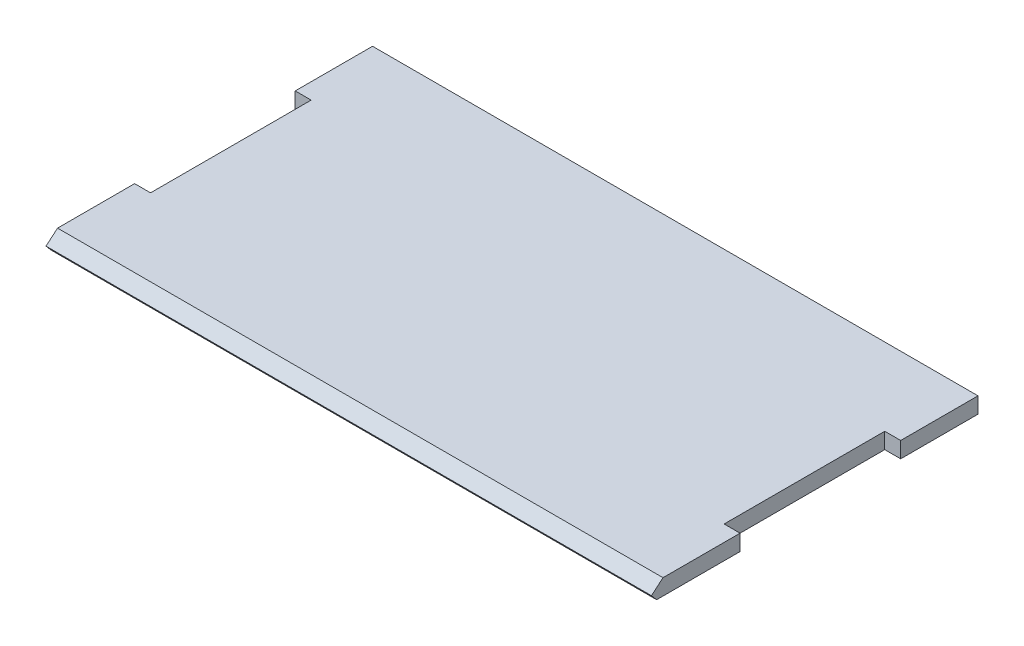
ISO-10303-21;
HEADER;
FILE_DESCRIPTION(('STEP AP214'),'2;1');
FILE_NAME('part.step','',(''),(''),'','','');
FILE_SCHEMA(('AUTOMOTIVE_DESIGN { 1 0 10303 214 1 1 1 1 }'));
ENDSEC;
DATA;
#1=APPLICATION_CONTEXT('core data for automotive mechanical design processes');
#2=APPLICATION_PROTOCOL_DEFINITION('international standard','automotive_design',2000,#1);
#3=PRODUCT_CONTEXT('',#1,'mechanical');
#4=PRODUCT('Part','Part','',(#3));
#5=PRODUCT_RELATED_PRODUCT_CATEGORY('part','',(#4));
#6=PRODUCT_DEFINITION_FORMATION('','',#4);
#7=PRODUCT_DEFINITION_CONTEXT('part definition',#1,'design');
#8=PRODUCT_DEFINITION('design','',#6,#7);
#9=PRODUCT_DEFINITION_SHAPE('','',#8);
#10=(LENGTH_UNIT() NAMED_UNIT(*) SI_UNIT(.MILLI.,.METRE.));
#11=(NAMED_UNIT(*) PLANE_ANGLE_UNIT() SI_UNIT($,.RADIAN.));
#12=(NAMED_UNIT(*) SI_UNIT($,.STERADIAN.) SOLID_ANGLE_UNIT());
#13=UNCERTAINTY_MEASURE_WITH_UNIT(LENGTH_MEASURE(1.E-05),#10,'distance_accuracy_value','');
#14=(GEOMETRIC_REPRESENTATION_CONTEXT(3) GLOBAL_UNCERTAINTY_ASSIGNED_CONTEXT((#13)) GLOBAL_UNIT_ASSIGNED_CONTEXT((#10,
#11,#12)) REPRESENTATION_CONTEXT('',''));
#15=CARTESIAN_POINT('',(0.,0.,0.));
#16=DIRECTION('',(0.,0.,1.));
#17=DIRECTION('',(1.,0.,0.));
#18=AXIS2_PLACEMENT_3D('',#15,#16,#17);
#19=CARTESIAN_POINT('',(30.1625,-1.58749999999996,109.115001669591));
#20=DIRECTION('',(-1.,0.,0.));
#21=DIRECTION('',(0.,0.,1.));
#22=AXIS2_PLACEMENT_3D('',#19,#20,#21);
#23=PLANE('',#22);
#24=DIRECTION('',(0.,0.,-1.));
#25=VECTOR('',#24,1.);
#26=CARTESIAN_POINT('',(30.1625,-1.58749999999996,109.115001669591));
#27=LINE('',#26,#25);
#28=CARTESIAN_POINT('',(30.1625,-1.58749999999996,32.0178548245103));
#29=VERTEX_POINT('',#28);
#30=CARTESIAN_POINT('',(30.1625,-1.58749999999997,23.70582));
#31=VERTEX_POINT('',#30);
#32=EDGE_CURVE('E164',#29,#31,#27,.T.);
#33=ORIENTED_EDGE('',*,*,#32,.T.);
#34=DIRECTION('',(0.,1.,0.));
#35=VECTOR('',#34,1.);
#36=CARTESIAN_POINT('',(30.1625,-1.58749999999997,23.70582));
#37=LINE('',#36,#35);
#38=CARTESIAN_POINT('',(30.1625,0.,23.70582));
#39=VERTEX_POINT('',#38);
#40=EDGE_CURVE('E242',#31,#39,#37,.T.);
#41=ORIENTED_EDGE('',*,*,#40,.T.);
#42=DIRECTION('',(0.,0.,-1.));
#43=VECTOR('',#42,1.);
#44=CARTESIAN_POINT('',(30.1625,0.,109.115001669591));
#45=LINE('',#44,#43);
#46=CARTESIAN_POINT('',(30.1625,0.,31.3848165744489));
#47=VERTEX_POINT('',#46);
#48=EDGE_CURVE('E165',#47,#39,#45,.T.);
#49=ORIENTED_EDGE('',*,*,#48,.F.);
#50=DIRECTION('',(0.,-0.647178984775271,0.762338088819684));
#51=VECTOR('',#50,1.);
#52=CARTESIAN_POINT('',(30.1625,-39.0145880016666,77.3416649161882));
#53=LINE('',#52,#51);
#54=CARTESIAN_POINT('',(30.1625,-0.9772310822675,32.5359362694892));
#55=VERTEX_POINT('',#54);
#56=EDGE_CURVE('E51',#47,#55,#53,.T.);
#57=ORIENTED_EDGE('',*,*,#56,.T.);
#58=DIRECTION('',(0.,0.762338088819684,0.647178984775271));
#59=VECTOR('',#58,1.);
#60=CARTESIAN_POINT('',(30.1625,-17.385197640956,18.6065638618743));
#61=LINE('',#60,#59);
#62=EDGE_CURVE('E207',#29,#55,#61,.T.);
#63=ORIENTED_EDGE('',*,*,#62,.F.);
#64=EDGE_LOOP('',(#33,#41,#49,#57,#63));
#65=FACE_BOUND('',#64,.T.);
#66=ADVANCED_FACE('F41',(#65),#23,.F.);
#67=CARTESIAN_POINT('',(-30.1625,-1.58749999999996,109.115001669591));
#68=DIRECTION('',(1.,0.,0.));
#69=DIRECTION('',(0.,0.,-1.));
#70=AXIS2_PLACEMENT_3D('',#67,#68,#69);
#71=PLANE('',#70);
#72=DIRECTION('',(0.,0.,-1.));
#73=VECTOR('',#72,1.);
#74=CARTESIAN_POINT('',(-30.1625,-1.58749999999996,109.115001669591));
#75=LINE('',#74,#73);
#76=CARTESIAN_POINT('',(-30.1625,-1.58749999999997,7.70382));
#77=VERTEX_POINT('',#76);
#78=CARTESIAN_POINT('',(-30.1625,-1.58749999999996,0.));
#79=VERTEX_POINT('',#78);
#80=EDGE_CURVE('E170',#77,#79,#75,.T.);
#81=ORIENTED_EDGE('',*,*,#80,.F.);
#82=DIRECTION('',(0.,1.,0.));
#83=VECTOR('',#82,1.);
#84=CARTESIAN_POINT('',(-30.1625,-1.58749999999997,7.70382));
#85=LINE('',#84,#83);
#86=CARTESIAN_POINT('',(-30.1625,0.,7.70382));
#87=VERTEX_POINT('',#86);
#88=EDGE_CURVE('E230',#77,#87,#85,.T.);
#89=ORIENTED_EDGE('',*,*,#88,.T.);
#90=DIRECTION('',(0.,0.,-1.));
#91=VECTOR('',#90,1.);
#92=CARTESIAN_POINT('',(-30.1625,0.,109.115001669591));
#93=LINE('',#92,#91);
#94=CARTESIAN_POINT('',(-30.1625,0.,0.));
#95=VERTEX_POINT('',#94);
#96=EDGE_CURVE('E200',#87,#95,#93,.T.);
#97=ORIENTED_EDGE('',*,*,#96,.T.);
#98=DIRECTION('',(0.,-1.,0.));
#99=VECTOR('',#98,1.);
#100=CARTESIAN_POINT('',(-30.1625,-1.58749999999996,0.));
#101=LINE('',#100,#99);
#102=EDGE_CURVE('E194',#95,#79,#101,.T.);
#103=ORIENTED_EDGE('',*,*,#102,.T.);
#104=EDGE_LOOP('',(#81,#89,#97,#103));
#105=FACE_BOUND('',#104,.T.);
#106=ADVANCED_FACE('F198',(#105),#71,.F.);
#107=CARTESIAN_POINT('',(0.,0.,0.));
#108=DIRECTION('',(0.,0.,-1.));
#109=DIRECTION('',(-1.,0.,0.));
#110=AXIS2_PLACEMENT_3D('',#107,#108,#109);
#111=PLANE('',#110);
#112=ORIENTED_EDGE('',*,*,#102,.F.);
#113=DIRECTION('',(-1.,0.,0.));
#114=VECTOR('',#113,1.);
#115=CARTESIAN_POINT('',(-30.1625,0.,0.));
#116=LINE('',#115,#114);
#117=CARTESIAN_POINT('',(30.1625,0.,0.));
#118=VERTEX_POINT('',#117);
#119=EDGE_CURVE('E213',#118,#95,#116,.T.);
#120=ORIENTED_EDGE('',*,*,#119,.F.);
#121=DIRECTION('',(0.,1.,0.));
#122=VECTOR('',#121,1.);
#123=CARTESIAN_POINT('',(30.1625,-1.58749999999996,0.));
#124=LINE('',#123,#122);
#125=CARTESIAN_POINT('',(30.1625,-1.58749999999996,0.));
#126=VERTEX_POINT('',#125);
#127=EDGE_CURVE('E195',#126,#118,#124,.T.);
#128=ORIENTED_EDGE('',*,*,#127,.F.);
#129=DIRECTION('',(1.,0.,0.));
#130=VECTOR('',#129,1.);
#131=CARTESIAN_POINT('',(-30.1625,-1.58749999999996,0.));
#132=LINE('',#131,#130);
#133=EDGE_CURVE('E161',#79,#126,#132,.T.);
#134=ORIENTED_EDGE('',*,*,#133,.F.);
#135=EDGE_LOOP('',(#112,#120,#128,#134));
#136=FACE_BOUND('',#135,.T.);
#137=ADVANCED_FACE('F192',(#136),#111,.T.);
#138=CARTESIAN_POINT('',(-30.1625,0.,109.115001669591));
#139=DIRECTION('',(0.,-1.,0.));
#140=DIRECTION('',(0.,0.,-1.));
#141=AXIS2_PLACEMENT_3D('',#138,#139,#140);
#142=PLANE('',#141);
#143=ORIENTED_EDGE('',*,*,#48,.T.);
#144=DIRECTION('',(1.,0.,0.));
#145=VECTOR('',#144,1.);
#146=CARTESIAN_POINT('',(30.1625,0.,23.70582));
#147=LINE('',#146,#145);
#148=CARTESIAN_POINT('',(28.575,0.,23.70582));
#149=VERTEX_POINT('',#148);
#150=EDGE_CURVE('E147',#149,#39,#147,.T.);
#151=ORIENTED_EDGE('',*,*,#150,.F.);
#152=DIRECTION('',(0.,0.,1.));
#153=VECTOR('',#152,1.);
#154=CARTESIAN_POINT('',(28.575,0.,7.70382));
#155=LINE('',#154,#153);
#156=CARTESIAN_POINT('',(28.575,0.,7.70382));
#157=VERTEX_POINT('',#156);
#158=EDGE_CURVE('E228',#157,#149,#155,.T.);
#159=ORIENTED_EDGE('',*,*,#158,.F.);
#160=DIRECTION('',(-1.,0.,0.));
#161=VECTOR('',#160,1.);
#162=CARTESIAN_POINT('',(30.1625,0.,7.70382));
#163=LINE('',#162,#161);
#164=CARTESIAN_POINT('',(30.1625,0.,7.70382));
#165=VERTEX_POINT('',#164);
#166=EDGE_CURVE('E225',#165,#157,#163,.T.);
#167=ORIENTED_EDGE('',*,*,#166,.F.);
#168=EDGE_CURVE('E155',#165,#118,#45,.T.);
#169=ORIENTED_EDGE('',*,*,#168,.T.);
#170=ORIENTED_EDGE('',*,*,#119,.T.);
#171=ORIENTED_EDGE('',*,*,#96,.F.);
#172=DIRECTION('',(-1.,0.,0.));
#173=VECTOR('',#172,1.);
#174=CARTESIAN_POINT('',(-30.1625,0.,7.70382));
#175=LINE('',#174,#173);
#176=CARTESIAN_POINT('',(-28.575,0.,7.70382));
#177=VERTEX_POINT('',#176);
#178=EDGE_CURVE('E255',#177,#87,#175,.T.);
#179=ORIENTED_EDGE('',*,*,#178,.F.);
#180=DIRECTION('',(0.,0.,-1.));
#181=VECTOR('',#180,1.);
#182=CARTESIAN_POINT('',(-28.575,0.,7.70382));
#183=LINE('',#182,#181);
#184=CARTESIAN_POINT('',(-28.575,0.,23.70582));
#185=VERTEX_POINT('',#184);
#186=EDGE_CURVE('E265',#185,#177,#183,.T.);
#187=ORIENTED_EDGE('',*,*,#186,.F.);
#188=DIRECTION('',(1.,0.,0.));
#189=VECTOR('',#188,1.);
#190=CARTESIAN_POINT('',(-30.1625,0.,23.70582));
#191=LINE('',#190,#189);
#192=CARTESIAN_POINT('',(-30.1625,0.,23.70582));
#193=VERTEX_POINT('',#192);
#194=EDGE_CURVE('E261',#193,#185,#191,.T.);
#195=ORIENTED_EDGE('',*,*,#194,.F.);
#196=CARTESIAN_POINT('',(-30.1625,0.,31.3848165744489));
#197=VERTEX_POINT('',#196);
#198=EDGE_CURVE('E215',#197,#193,#93,.T.);
#199=ORIENTED_EDGE('',*,*,#198,.F.);
#200=DIRECTION('',(1.,0.,0.));
#201=VECTOR('',#200,1.);
#202=CARTESIAN_POINT('',(-30.1625,0.,31.3848165744489));
#203=LINE('',#202,#201);
#204=EDGE_CURVE('E45',#197,#47,#203,.T.);
#205=ORIENTED_EDGE('',*,*,#204,.T.);
#206=EDGE_LOOP('',(#143,#151,#159,#167,#169,#170,#171,#179,#187,#195,#199,#205));
#207=FACE_BOUND('',#206,.T.);
#208=ADVANCED_FACE('F223',(#207),#142,.F.);
#209=ORIENTED_EDGE('',*,*,#168,.F.);
#210=DIRECTION('',(0.,1.,0.));
#211=VECTOR('',#210,1.);
#212=CARTESIAN_POINT('',(30.1625,-1.58749999999997,7.70382));
#213=LINE('',#212,#211);
#214=CARTESIAN_POINT('',(30.1625,-1.58749999999997,7.70382));
#215=VERTEX_POINT('',#214);
#216=EDGE_CURVE('E141',#215,#165,#213,.T.);
#217=ORIENTED_EDGE('',*,*,#216,.F.);
#218=EDGE_CURVE('E153',#215,#126,#27,.T.);
#219=ORIENTED_EDGE('',*,*,#218,.T.);
#220=ORIENTED_EDGE('',*,*,#127,.T.);
#221=EDGE_LOOP('',(#209,#217,#219,#220));
#222=FACE_BOUND('',#221,.T.);
#223=ADVANCED_FACE('F151',(#222),#23,.F.);
#224=CARTESIAN_POINT('',(-30.1625,-1.58749999999996,109.115001669591));
#225=DIRECTION('',(0.,1.,0.));
#226=DIRECTION('',(0.,0.,1.));
#227=AXIS2_PLACEMENT_3D('',#224,#225,#226);
#228=PLANE('',#227);
#229=DIRECTION('',(0.,0.,1.));
#230=VECTOR('',#229,1.);
#231=CARTESIAN_POINT('',(28.575,-1.58749999999997,7.70382));
#232=LINE('',#231,#230);
#233=CARTESIAN_POINT('',(28.575,-1.58749999999996,7.70382));
#234=VERTEX_POINT('',#233);
#235=CARTESIAN_POINT('',(28.575,-1.58749999999997,23.70582));
#236=VERTEX_POINT('',#235);
#237=EDGE_CURVE('E59',#234,#236,#232,.T.);
#238=ORIENTED_EDGE('',*,*,#237,.T.);
#239=DIRECTION('',(1.,0.,0.));
#240=VECTOR('',#239,1.);
#241=CARTESIAN_POINT('',(30.1625,-1.58749999999997,23.70582));
#242=LINE('',#241,#240);
#243=EDGE_CURVE('E157',#236,#31,#242,.T.);
#244=ORIENTED_EDGE('',*,*,#243,.T.);
#245=ORIENTED_EDGE('',*,*,#32,.F.);
#246=DIRECTION('',(1.,0.,0.));
#247=VECTOR('',#246,1.);
#248=CARTESIAN_POINT('',(-30.1625,-1.58749999999997,32.0178548245103));
#249=LINE('',#248,#247);
#250=CARTESIAN_POINT('',(-30.1625,-1.58749999999997,32.0178548245103));
#251=VERTEX_POINT('',#250);
#252=EDGE_CURVE('E246',#251,#29,#249,.T.);
#253=ORIENTED_EDGE('',*,*,#252,.F.);
#254=CARTESIAN_POINT('',(-30.1625,-1.58749999999996,23.70582));
#255=VERTEX_POINT('',#254);
#256=EDGE_CURVE('E174',#251,#255,#75,.T.);
#257=ORIENTED_EDGE('',*,*,#256,.T.);
#258=DIRECTION('',(1.,0.,0.));
#259=VECTOR('',#258,1.);
#260=CARTESIAN_POINT('',(-30.1625,-1.58749999999997,23.70582));
#261=LINE('',#260,#259);
#262=CARTESIAN_POINT('',(-28.575,-1.58749999999997,23.70582));
#263=VERTEX_POINT('',#262);
#264=EDGE_CURVE('E67',#255,#263,#261,.T.);
#265=ORIENTED_EDGE('',*,*,#264,.T.);
#266=DIRECTION('',(0.,0.,-1.));
#267=VECTOR('',#266,1.);
#268=CARTESIAN_POINT('',(-28.575,-1.58749999999997,7.70382));
#269=LINE('',#268,#267);
#270=CARTESIAN_POINT('',(-28.575,-1.58749999999997,7.70382));
#271=VERTEX_POINT('',#270);
#272=EDGE_CURVE('E254',#263,#271,#269,.T.);
#273=ORIENTED_EDGE('',*,*,#272,.T.);
#274=DIRECTION('',(-1.,0.,0.));
#275=VECTOR('',#274,1.);
#276=CARTESIAN_POINT('',(-30.1625,-1.58749999999997,7.70382));
#277=LINE('',#276,#275);
#278=EDGE_CURVE('E186',#271,#77,#277,.T.);
#279=ORIENTED_EDGE('',*,*,#278,.T.);
#280=ORIENTED_EDGE('',*,*,#80,.T.);
#281=ORIENTED_EDGE('',*,*,#133,.T.);
#282=ORIENTED_EDGE('',*,*,#218,.F.);
#283=DIRECTION('',(-1.,0.,0.));
#284=VECTOR('',#283,1.);
#285=CARTESIAN_POINT('',(30.1625,-1.58749999999997,7.70382));
#286=LINE('',#285,#284);
#287=EDGE_CURVE('E137',#215,#234,#286,.T.);
#288=ORIENTED_EDGE('',*,*,#287,.T.);
#289=EDGE_LOOP('',(#238,#244,#245,#253,#257,#265,#273,#279,#280,#281,#282,#288));
#290=FACE_BOUND('',#289,.T.);
#291=ADVANCED_FACE('F159',(#290),#228,.F.);
#292=ORIENTED_EDGE('',*,*,#198,.T.);
#293=DIRECTION('',(0.,1.,0.));
#294=VECTOR('',#293,1.);
#295=CARTESIAN_POINT('',(-30.1625,-1.58749999999997,23.70582));
#296=LINE('',#295,#294);
#297=EDGE_CURVE('E260',#255,#193,#296,.T.);
#298=ORIENTED_EDGE('',*,*,#297,.F.);
#299=ORIENTED_EDGE('',*,*,#256,.F.);
#300=DIRECTION('',(0.,0.762338088819684,0.647178984775271));
#301=VECTOR('',#300,1.);
#302=CARTESIAN_POINT('',(-30.1625,-17.385197640956,18.6065638618743));
#303=LINE('',#302,#301);
#304=CARTESIAN_POINT('',(-30.1625,-0.977231082267507,32.535936269489));
#305=VERTEX_POINT('',#304);
#306=EDGE_CURVE('E203',#251,#305,#303,.T.);
#307=ORIENTED_EDGE('',*,*,#306,.T.);
#308=DIRECTION('',(0.,0.647178984775271,-0.762338088819684));
#309=VECTOR('',#308,1.);
#310=CARTESIAN_POINT('',(-30.1625,-39.0145880016666,77.3416649161882));
#311=LINE('',#310,#309);
#312=EDGE_CURVE('E11',#305,#197,#311,.T.);
#313=ORIENTED_EDGE('',*,*,#312,.T.);
#314=EDGE_LOOP('',(#292,#298,#299,#307,#313));
#315=FACE_BOUND('',#314,.T.);
#316=ADVANCED_FACE('F43',(#315),#71,.F.);
#317=CARTESIAN_POINT('',(-30.1625,0.0501655560633256,31.3257245534879));
#318=DIRECTION('',(0.,-0.762338088819684,-0.647178984775272));
#319=DIRECTION('',(0.,0.647178984775272,-0.762338088819684));
#320=AXIS2_PLACEMENT_3D('',#317,#318,#319);
#321=PLANE('',#320);
#322=ORIENTED_EDGE('',*,*,#312,.F.);
#323=DIRECTION('',(-1.,0.,0.));
#324=VECTOR('',#323,1.);
#325=CARTESIAN_POINT('',(-30.1625,-0.977231082267507,32.535936269489));
#326=LINE('',#325,#324);
#327=EDGE_CURVE('E280',#55,#305,#326,.T.);
#328=ORIENTED_EDGE('',*,*,#327,.F.);
#329=ORIENTED_EDGE('',*,*,#56,.F.);
#330=ORIENTED_EDGE('',*,*,#204,.F.);
#331=EDGE_LOOP('',(#322,#328,#329,#330));
#332=FACE_BOUND('',#331,.T.);
#333=ADVANCED_FACE('F294',(#332),#321,.F.);
#334=CARTESIAN_POINT('',(-30.1625,-17.385197640956,18.6065638618743));
#335=DIRECTION('',(0.,0.647178984775271,-0.762338088819684));
#336=DIRECTION('',(0.,0.762338088819684,0.647178984775271));
#337=AXIS2_PLACEMENT_3D('',#334,#335,#336);
#338=PLANE('',#337);
#339=ORIENTED_EDGE('',*,*,#252,.T.);
#340=ORIENTED_EDGE('',*,*,#62,.T.);
#341=ORIENTED_EDGE('',*,*,#327,.T.);
#342=ORIENTED_EDGE('',*,*,#306,.F.);
#343=EDGE_LOOP('',(#339,#340,#341,#342));
#344=FACE_BOUND('',#343,.T.);
#345=ADVANCED_FACE('F296',(#344),#338,.F.);
#346=CARTESIAN_POINT('',(-30.1625,-1.58749999999997,7.70382));
#347=DIRECTION('',(0.,0.,-1.));
#348=DIRECTION('',(-1.,0.,0.));
#349=AXIS2_PLACEMENT_3D('',#346,#347,#348);
#350=PLANE('',#349);
#351=ORIENTED_EDGE('',*,*,#178,.T.);
#352=ORIENTED_EDGE('',*,*,#88,.F.);
#353=ORIENTED_EDGE('',*,*,#278,.F.);
#354=DIRECTION('',(0.,1.,0.));
#355=VECTOR('',#354,1.);
#356=CARTESIAN_POINT('',(-28.575,-1.58749999999997,7.70382));
#357=LINE('',#356,#355);
#358=EDGE_CURVE('E235',#271,#177,#357,.T.);
#359=ORIENTED_EDGE('',*,*,#358,.T.);
#360=EDGE_LOOP('',(#351,#352,#353,#359));
#361=FACE_BOUND('',#360,.T.);
#362=ADVANCED_FACE('F305',(#361),#350,.F.);
#363=CARTESIAN_POINT('',(-28.575,-1.58749999999997,7.70382));
#364=DIRECTION('',(1.,0.,0.));
#365=DIRECTION('',(0.,0.,-1.));
#366=AXIS2_PLACEMENT_3D('',#363,#364,#365);
#367=PLANE('',#366);
#368=ORIENTED_EDGE('',*,*,#186,.T.);
#369=ORIENTED_EDGE('',*,*,#358,.F.);
#370=ORIENTED_EDGE('',*,*,#272,.F.);
#371=DIRECTION('',(0.,1.,0.));
#372=VECTOR('',#371,1.);
#373=CARTESIAN_POINT('',(-28.575,-1.58749999999997,23.70582));
#374=LINE('',#373,#372);
#375=EDGE_CURVE('E273',#263,#185,#374,.T.);
#376=ORIENTED_EDGE('',*,*,#375,.T.);
#377=EDGE_LOOP('',(#368,#369,#370,#376));
#378=FACE_BOUND('',#377,.T.);
#379=ADVANCED_FACE('F302',(#378),#367,.F.);
#380=CARTESIAN_POINT('',(-30.1625,-1.58749999999997,23.70582));
#381=DIRECTION('',(0.,0.,1.));
#382=DIRECTION('',(1.,0.,0.));
#383=AXIS2_PLACEMENT_3D('',#380,#381,#382);
#384=PLANE('',#383);
#385=ORIENTED_EDGE('',*,*,#194,.T.);
#386=ORIENTED_EDGE('',*,*,#375,.F.);
#387=ORIENTED_EDGE('',*,*,#264,.F.);
#388=ORIENTED_EDGE('',*,*,#297,.T.);
#389=EDGE_LOOP('',(#385,#386,#387,#388));
#390=FACE_BOUND('',#389,.T.);
#391=ADVANCED_FACE('F298',(#390),#384,.F.);
#392=CARTESIAN_POINT('',(30.1625,-1.58749999999997,23.70582));
#393=DIRECTION('',(0.,0.,1.));
#394=DIRECTION('',(1.,0.,0.));
#395=AXIS2_PLACEMENT_3D('',#392,#393,#394);
#396=PLANE('',#395);
#397=ORIENTED_EDGE('',*,*,#150,.T.);
#398=ORIENTED_EDGE('',*,*,#40,.F.);
#399=ORIENTED_EDGE('',*,*,#243,.F.);
#400=DIRECTION('',(0.,1.,0.));
#401=VECTOR('',#400,1.);
#402=CARTESIAN_POINT('',(28.575,-1.58749999999997,23.70582));
#403=LINE('',#402,#401);
#404=EDGE_CURVE('E247',#236,#149,#403,.T.);
#405=ORIENTED_EDGE('',*,*,#404,.T.);
#406=EDGE_LOOP('',(#397,#398,#399,#405));
#407=FACE_BOUND('',#406,.T.);
#408=ADVANCED_FACE('F334',(#407),#396,.F.);
#409=CARTESIAN_POINT('',(28.575,-1.58749999999997,7.70382));
#410=DIRECTION('',(-1.,0.,0.));
#411=DIRECTION('',(0.,0.,1.));
#412=AXIS2_PLACEMENT_3D('',#409,#410,#411);
#413=PLANE('',#412);
#414=ORIENTED_EDGE('',*,*,#158,.T.);
#415=ORIENTED_EDGE('',*,*,#404,.F.);
#416=ORIENTED_EDGE('',*,*,#237,.F.);
#417=DIRECTION('',(0.,1.,0.));
#418=VECTOR('',#417,1.);
#419=CARTESIAN_POINT('',(28.575,-1.58749999999997,7.70382));
#420=LINE('',#419,#418);
#421=EDGE_CURVE('E143',#234,#157,#420,.T.);
#422=ORIENTED_EDGE('',*,*,#421,.T.);
#423=EDGE_LOOP('',(#414,#415,#416,#422));
#424=FACE_BOUND('',#423,.T.);
#425=ADVANCED_FACE('F338',(#424),#413,.F.);
#426=CARTESIAN_POINT('',(30.1625,-1.58749999999997,7.70382));
#427=DIRECTION('',(0.,0.,-1.));
#428=DIRECTION('',(-1.,0.,0.));
#429=AXIS2_PLACEMENT_3D('',#426,#427,#428);
#430=PLANE('',#429);
#431=ORIENTED_EDGE('',*,*,#166,.T.);
#432=ORIENTED_EDGE('',*,*,#421,.F.);
#433=ORIENTED_EDGE('',*,*,#287,.F.);
#434=ORIENTED_EDGE('',*,*,#216,.T.);
#435=EDGE_LOOP('',(#431,#432,#433,#434));
#436=FACE_BOUND('',#435,.T.);
#437=ADVANCED_FACE('F140',(#436),#430,.F.);
#438=CLOSED_SHELL('',(#66,#106,#137,#208,#223,#291,#316,#333,#345,#362,#379,#391,#408,#425,#437));
#439=MANIFOLD_SOLID_BREP('B2',#438);
#440=ADVANCED_BREP_SHAPE_REPRESENTATION('',(#18,#439),#14);
#441=SHAPE_DEFINITION_REPRESENTATION(#9,#440);
ENDSEC;
END-ISO-10303-21;
